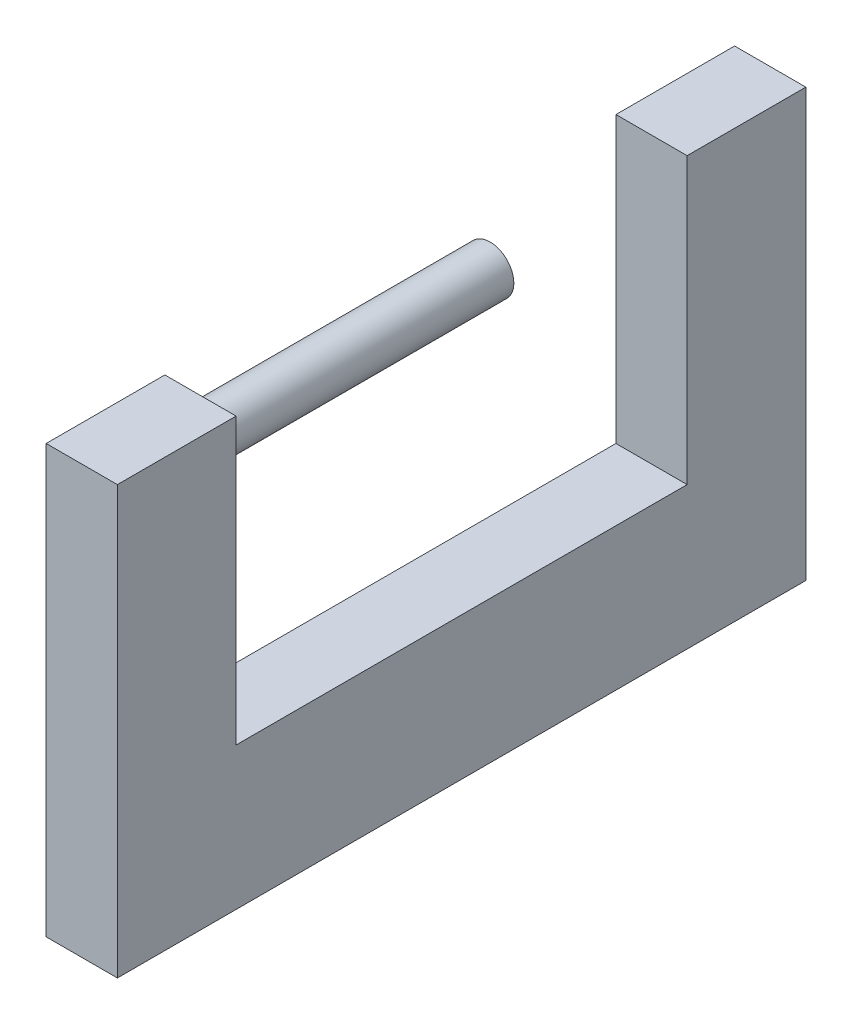
ISO-10303-21;
HEADER;
FILE_DESCRIPTION(('STEP AP214'),'2;1');
FILE_NAME('part.step','',(''),(''),'','','');
FILE_SCHEMA(('AUTOMOTIVE_DESIGN { 1 0 10303 214 1 1 1 1 }'));
ENDSEC;
DATA;
#1=APPLICATION_CONTEXT('core data for automotive mechanical design processes');
#2=APPLICATION_PROTOCOL_DEFINITION('international standard','automotive_design',2000,#1);
#3=PRODUCT_CONTEXT('',#1,'mechanical');
#4=PRODUCT('Part','Part','',(#3));
#5=PRODUCT_RELATED_PRODUCT_CATEGORY('part','',(#4));
#6=PRODUCT_DEFINITION_FORMATION('','',#4);
#7=PRODUCT_DEFINITION_CONTEXT('part definition',#1,'design');
#8=PRODUCT_DEFINITION('design','',#6,#7);
#9=PRODUCT_DEFINITION_SHAPE('','',#8);
#10=(LENGTH_UNIT() NAMED_UNIT(*) SI_UNIT(.MILLI.,.METRE.));
#11=(NAMED_UNIT(*) PLANE_ANGLE_UNIT() SI_UNIT($,.RADIAN.));
#12=(NAMED_UNIT(*) SI_UNIT($,.STERADIAN.) SOLID_ANGLE_UNIT());
#13=UNCERTAINTY_MEASURE_WITH_UNIT(LENGTH_MEASURE(1.E-05),#10,'distance_accuracy_value','');
#14=(GEOMETRIC_REPRESENTATION_CONTEXT(3) GLOBAL_UNCERTAINTY_ASSIGNED_CONTEXT((#13)) GLOBAL_UNIT_ASSIGNED_CONTEXT((#10,
#11,#12)) REPRESENTATION_CONTEXT('',''));
#15=CARTESIAN_POINT('',(0.,0.,0.));
#16=DIRECTION('',(0.,0.,1.));
#17=DIRECTION('',(1.,0.,0.));
#18=AXIS2_PLACEMENT_3D('',#15,#16,#17);
#19=CARTESIAN_POINT('',(15.,60.,0.));
#20=DIRECTION('',(0.,0.,-1.));
#21=DIRECTION('',(-1.,0.,0.));
#22=AXIS2_PLACEMENT_3D('',#19,#20,#21);
#23=PLANE('',#22);
#24=DIRECTION('',(0.,-1.,0.));
#25=VECTOR('',#24,1.);
#26=CARTESIAN_POINT('',(0.,60.,0.));
#27=LINE('',#26,#25);
#28=CARTESIAN_POINT('',(0.,60.,0.));
#29=VERTEX_POINT('',#28);
#30=CARTESIAN_POINT('',(0.,0.,0.));
#31=VERTEX_POINT('',#30);
#32=EDGE_CURVE('E137',#29,#31,#27,.T.);
#33=ORIENTED_EDGE('',*,*,#32,.T.);
#34=DIRECTION('',(-1.,0.,0.));
#35=VECTOR('',#34,1.);
#36=CARTESIAN_POINT('',(15.,0.,0.));
#37=LINE('',#36,#35);
#38=CARTESIAN_POINT('',(15.,0.,0.));
#39=VERTEX_POINT('',#38);
#40=EDGE_CURVE('E50',#39,#31,#37,.T.);
#41=ORIENTED_EDGE('',*,*,#40,.F.);
#42=DIRECTION('',(0.,-1.,0.));
#43=VECTOR('',#42,1.);
#44=CARTESIAN_POINT('',(15.,60.,0.));
#45=LINE('',#44,#43);
#46=CARTESIAN_POINT('',(15.,60.,0.));
#47=VERTEX_POINT('',#46);
#48=EDGE_CURVE('E151',#47,#39,#45,.T.);
#49=ORIENTED_EDGE('',*,*,#48,.F.);
#50=DIRECTION('',(-1.,0.,0.));
#51=VECTOR('',#50,1.);
#52=CARTESIAN_POINT('',(15.,60.,0.));
#53=LINE('',#52,#51);
#54=EDGE_CURVE('E135',#47,#29,#53,.T.);
#55=ORIENTED_EDGE('',*,*,#54,.T.);
#56=EDGE_LOOP('',(#33,#41,#49,#55));
#57=FACE_BOUND('',#56,.T.);
#58=ADVANCED_FACE('F39',(#57),#23,.F.);
#59=CARTESIAN_POINT('',(15.,0.,0.));
#60=DIRECTION('',(0.,-1.,0.));
#61=DIRECTION('',(0.,0.,-1.));
#62=AXIS2_PLACEMENT_3D('',#59,#60,#61);
#63=PLANE('',#62);
#64=DIRECTION('',(0.,0.,1.));
#65=VECTOR('',#64,1.);
#66=CARTESIAN_POINT('',(0.,0.,0.));
#67=LINE('',#66,#65);
#68=CARTESIAN_POINT('',(0.,0.,95.));
#69=VERTEX_POINT('',#68);
#70=EDGE_CURVE('E136',#31,#69,#67,.T.);
#71=ORIENTED_EDGE('',*,*,#70,.T.);
#72=DIRECTION('',(-1.,0.,0.));
#73=VECTOR('',#72,1.);
#74=CARTESIAN_POINT('',(15.,0.,95.));
#75=LINE('',#74,#73);
#76=CARTESIAN_POINT('',(15.,0.,95.));
#77=VERTEX_POINT('',#76);
#78=EDGE_CURVE('E161',#77,#69,#75,.T.);
#79=ORIENTED_EDGE('',*,*,#78,.F.);
#80=DIRECTION('',(0.,0.,1.));
#81=VECTOR('',#80,1.);
#82=CARTESIAN_POINT('',(15.,0.,0.));
#83=LINE('',#82,#81);
#84=EDGE_CURVE('E97',#39,#77,#83,.T.);
#85=ORIENTED_EDGE('',*,*,#84,.F.);
#86=ORIENTED_EDGE('',*,*,#40,.T.);
#87=EDGE_LOOP('',(#71,#79,#85,#86));
#88=FACE_BOUND('',#87,.T.);
#89=ADVANCED_FACE('F163',(#88),#63,.F.);
#90=CARTESIAN_POINT('',(15.,0.,95.));
#91=DIRECTION('',(0.,0.,1.));
#92=DIRECTION('',(0.,-1.,0.));
#93=AXIS2_PLACEMENT_3D('',#90,#91,#92);
#94=PLANE('',#93);
#95=CARTESIAN_POINT('',(7.5,52.5,95.));
#96=DIRECTION('',(0.,0.,1.));
#97=DIRECTION('',(0.,-1.,0.));
#98=AXIS2_PLACEMENT_3D('',#95,#96,#97);
#99=CIRCLE('',#98,5.);
#100=CARTESIAN_POINT('',(7.5,47.5,95.));
#101=VERTEX_POINT('',#100);
#102=EDGE_CURVE('E11',#101,#101,#99,.F.);
#103=ORIENTED_EDGE('',*,*,#102,.F.);
#104=EDGE_LOOP('',(#103));
#105=FACE_BOUND('',#104,.T.);
#106=DIRECTION('',(0.,1.,0.));
#107=VECTOR('',#106,1.);
#108=CARTESIAN_POINT('',(0.,0.,95.));
#109=LINE('',#108,#107);
#110=CARTESIAN_POINT('',(0.,60.,95.));
#111=VERTEX_POINT('',#110);
#112=EDGE_CURVE('E142',#69,#111,#109,.T.);
#113=ORIENTED_EDGE('',*,*,#112,.T.);
#114=DIRECTION('',(-1.,0.,0.));
#115=VECTOR('',#114,1.);
#116=CARTESIAN_POINT('',(15.,60.,95.));
#117=LINE('',#116,#115);
#118=CARTESIAN_POINT('',(15.,60.,95.));
#119=VERTEX_POINT('',#118);
#120=EDGE_CURVE('E158',#119,#111,#117,.T.);
#121=ORIENTED_EDGE('',*,*,#120,.F.);
#122=DIRECTION('',(0.,1.,0.));
#123=VECTOR('',#122,1.);
#124=CARTESIAN_POINT('',(15.,0.,95.));
#125=LINE('',#124,#123);
#126=EDGE_CURVE('E185',#77,#119,#125,.T.);
#127=ORIENTED_EDGE('',*,*,#126,.F.);
#128=ORIENTED_EDGE('',*,*,#78,.T.);
#129=EDGE_LOOP('',(#113,#121,#127,#128));
#130=FACE_BOUND('',#129,.T.);
#131=ADVANCED_FACE('F173',(#105,#130),#94,.F.);
#132=CARTESIAN_POINT('',(15.,60.,95.));
#133=DIRECTION('',(0.,-1.,0.));
#134=DIRECTION('',(0.,0.,-1.));
#135=AXIS2_PLACEMENT_3D('',#132,#133,#134);
#136=PLANE('',#135);
#137=DIRECTION('',(0.,0.,1.));
#138=VECTOR('',#137,1.);
#139=CARTESIAN_POINT('',(0.,60.,95.));
#140=LINE('',#139,#138);
#141=CARTESIAN_POINT('',(0.,60.,120.));
#142=VERTEX_POINT('',#141);
#143=EDGE_CURVE('E145',#111,#142,#140,.T.);
#144=ORIENTED_EDGE('',*,*,#143,.T.);
#145=DIRECTION('',(-1.,0.,0.));
#146=VECTOR('',#145,1.);
#147=CARTESIAN_POINT('',(15.,60.,120.));
#148=LINE('',#147,#146);
#149=CARTESIAN_POINT('',(15.,60.,120.));
#150=VERTEX_POINT('',#149);
#151=EDGE_CURVE('E154',#150,#142,#148,.T.);
#152=ORIENTED_EDGE('',*,*,#151,.F.);
#153=DIRECTION('',(0.,0.,1.));
#154=VECTOR('',#153,1.);
#155=CARTESIAN_POINT('',(15.,60.,95.));
#156=LINE('',#155,#154);
#157=EDGE_CURVE('E182',#119,#150,#156,.T.);
#158=ORIENTED_EDGE('',*,*,#157,.F.);
#159=ORIENTED_EDGE('',*,*,#120,.T.);
#160=EDGE_LOOP('',(#144,#152,#158,#159));
#161=FACE_BOUND('',#160,.T.);
#162=ADVANCED_FACE('F176',(#161),#136,.F.);
#163=CARTESIAN_POINT('',(15.,60.,120.));
#164=DIRECTION('',(0.,0.,-1.));
#165=DIRECTION('',(0.,1.,0.));
#166=AXIS2_PLACEMENT_3D('',#163,#164,#165);
#167=PLANE('',#166);
#168=DIRECTION('',(0.,-1.,0.));
#169=VECTOR('',#168,1.);
#170=CARTESIAN_POINT('',(0.,60.,120.));
#171=LINE('',#170,#169);
#172=CARTESIAN_POINT('',(0.,-30.,120.));
#173=VERTEX_POINT('',#172);
#174=EDGE_CURVE('E148',#142,#173,#171,.T.);
#175=ORIENTED_EDGE('',*,*,#174,.T.);
#176=DIRECTION('',(-1.,0.,0.));
#177=VECTOR('',#176,1.);
#178=CARTESIAN_POINT('',(15.,-30.,120.));
#179=LINE('',#178,#177);
#180=CARTESIAN_POINT('',(15.,-30.,120.));
#181=VERTEX_POINT('',#180);
#182=EDGE_CURVE('E130',#181,#173,#179,.T.);
#183=ORIENTED_EDGE('',*,*,#182,.F.);
#184=DIRECTION('',(0.,-1.,0.));
#185=VECTOR('',#184,1.);
#186=CARTESIAN_POINT('',(15.,60.,120.));
#187=LINE('',#186,#185);
#188=EDGE_CURVE('E119',#150,#181,#187,.T.);
#189=ORIENTED_EDGE('',*,*,#188,.F.);
#190=ORIENTED_EDGE('',*,*,#151,.T.);
#191=EDGE_LOOP('',(#175,#183,#189,#190));
#192=FACE_BOUND('',#191,.T.);
#193=ADVANCED_FACE('F202',(#192),#167,.F.);
#194=CARTESIAN_POINT('',(15.,-30.,120.));
#195=DIRECTION('',(0.,1.,0.));
#196=DIRECTION('',(0.,0.,1.));
#197=AXIS2_PLACEMENT_3D('',#194,#195,#196);
#198=PLANE('',#197);
#199=DIRECTION('',(0.,0.,-1.));
#200=VECTOR('',#199,1.);
#201=CARTESIAN_POINT('',(0.,-30.,120.));
#202=LINE('',#201,#200);
#203=CARTESIAN_POINT('',(0.,-30.,-25.));
#204=VERTEX_POINT('',#203);
#205=EDGE_CURVE('E127',#173,#204,#202,.T.);
#206=ORIENTED_EDGE('',*,*,#205,.T.);
#207=DIRECTION('',(-1.,0.,0.));
#208=VECTOR('',#207,1.);
#209=CARTESIAN_POINT('',(15.,-30.,-25.));
#210=LINE('',#209,#208);
#211=CARTESIAN_POINT('',(15.,-30.,-25.));
#212=VERTEX_POINT('',#211);
#213=EDGE_CURVE('E124',#212,#204,#210,.T.);
#214=ORIENTED_EDGE('',*,*,#213,.F.);
#215=DIRECTION('',(0.,0.,-1.));
#216=VECTOR('',#215,1.);
#217=CARTESIAN_POINT('',(15.,-30.,120.));
#218=LINE('',#217,#216);
#219=EDGE_CURVE('E115',#181,#212,#218,.T.);
#220=ORIENTED_EDGE('',*,*,#219,.F.);
#221=ORIENTED_EDGE('',*,*,#182,.T.);
#222=EDGE_LOOP('',(#206,#214,#220,#221));
#223=FACE_BOUND('',#222,.T.);
#224=ADVANCED_FACE('F121',(#223),#198,.F.);
#225=CARTESIAN_POINT('',(15.,-30.,-25.));
#226=DIRECTION('',(0.,0.,1.));
#227=DIRECTION('',(1.,0.,0.));
#228=AXIS2_PLACEMENT_3D('',#225,#226,#227);
#229=PLANE('',#228);
#230=DIRECTION('',(0.,1.,0.));
#231=VECTOR('',#230,1.);
#232=CARTESIAN_POINT('',(0.,-30.,-25.));
#233=LINE('',#232,#231);
#234=CARTESIAN_POINT('',(0.,60.,-25.));
#235=VERTEX_POINT('',#234);
#236=EDGE_CURVE('E81',#204,#235,#233,.T.);
#237=ORIENTED_EDGE('',*,*,#236,.T.);
#238=DIRECTION('',(-1.,0.,0.));
#239=VECTOR('',#238,1.);
#240=CARTESIAN_POINT('',(15.,60.,-25.));
#241=LINE('',#240,#239);
#242=CARTESIAN_POINT('',(15.,60.,-25.));
#243=VERTEX_POINT('',#242);
#244=EDGE_CURVE('E126',#243,#235,#241,.T.);
#245=ORIENTED_EDGE('',*,*,#244,.F.);
#246=DIRECTION('',(0.,1.,0.));
#247=VECTOR('',#246,1.);
#248=CARTESIAN_POINT('',(15.,-30.,-25.));
#249=LINE('',#248,#247);
#250=EDGE_CURVE('E117',#212,#243,#249,.T.);
#251=ORIENTED_EDGE('',*,*,#250,.F.);
#252=ORIENTED_EDGE('',*,*,#213,.T.);
#253=EDGE_LOOP('',(#237,#245,#251,#252));
#254=FACE_BOUND('',#253,.T.);
#255=ADVANCED_FACE('F128',(#254),#229,.F.);
#256=CARTESIAN_POINT('',(15.,60.,-25.));
#257=DIRECTION('',(0.,-1.,0.));
#258=DIRECTION('',(0.,0.,-1.));
#259=AXIS2_PLACEMENT_3D('',#256,#257,#258);
#260=PLANE('',#259);
#261=DIRECTION('',(0.,0.,1.));
#262=VECTOR('',#261,1.);
#263=CARTESIAN_POINT('',(0.,60.,-25.));
#264=LINE('',#263,#262);
#265=EDGE_CURVE('E89',#235,#29,#264,.T.);
#266=ORIENTED_EDGE('',*,*,#265,.T.);
#267=ORIENTED_EDGE('',*,*,#54,.F.);
#268=DIRECTION('',(0.,0.,1.));
#269=VECTOR('',#268,1.);
#270=CARTESIAN_POINT('',(15.,60.,-25.));
#271=LINE('',#270,#269);
#272=EDGE_CURVE('E54',#243,#47,#271,.T.);
#273=ORIENTED_EDGE('',*,*,#272,.F.);
#274=ORIENTED_EDGE('',*,*,#244,.T.);
#275=EDGE_LOOP('',(#266,#267,#273,#274));
#276=FACE_BOUND('',#275,.T.);
#277=ADVANCED_FACE('F244',(#276),#260,.F.);
#278=CARTESIAN_POINT('',(15.,0.,0.));
#279=DIRECTION('',(-1.,0.,0.));
#280=DIRECTION('',(0.,0.,1.));
#281=AXIS2_PLACEMENT_3D('',#278,#279,#280);
#282=PLANE('',#281);
#283=ORIENTED_EDGE('',*,*,#48,.T.);
#284=ORIENTED_EDGE('',*,*,#84,.T.);
#285=ORIENTED_EDGE('',*,*,#126,.T.);
#286=ORIENTED_EDGE('',*,*,#157,.T.);
#287=ORIENTED_EDGE('',*,*,#188,.T.);
#288=ORIENTED_EDGE('',*,*,#219,.T.);
#289=ORIENTED_EDGE('',*,*,#250,.T.);
#290=ORIENTED_EDGE('',*,*,#272,.T.);
#291=EDGE_LOOP('',(#283,#284,#285,#286,#287,#288,#289,#290));
#292=FACE_BOUND('',#291,.T.);
#293=ADVANCED_FACE('F111',(#292),#282,.F.);
#294=CARTESIAN_POINT('',(0.,0.,0.));
#295=DIRECTION('',(-1.,0.,0.));
#296=DIRECTION('',(0.,0.,1.));
#297=AXIS2_PLACEMENT_3D('',#294,#295,#296);
#298=PLANE('',#297);
#299=ORIENTED_EDGE('',*,*,#32,.F.);
#300=ORIENTED_EDGE('',*,*,#265,.F.);
#301=ORIENTED_EDGE('',*,*,#236,.F.);
#302=ORIENTED_EDGE('',*,*,#205,.F.);
#303=ORIENTED_EDGE('',*,*,#174,.F.);
#304=ORIENTED_EDGE('',*,*,#143,.F.);
#305=ORIENTED_EDGE('',*,*,#112,.F.);
#306=ORIENTED_EDGE('',*,*,#70,.F.);
#307=EDGE_LOOP('',(#299,#300,#301,#302,#303,#304,#305,#306));
#308=FACE_BOUND('',#307,.T.);
#309=ADVANCED_FACE('F166',(#308),#298,.T.);
#310=CARTESIAN_POINT('',(7.5,52.5,34.));
#311=DIRECTION('',(0.,0.,1.));
#312=DIRECTION('',(0.,-1.,0.));
#313=AXIS2_PLACEMENT_3D('',#310,#311,#312);
#314=CYLINDRICAL_SURFACE('',#313,5.);
#315=CARTESIAN_POINT('',(7.5,52.5,34.));
#316=DIRECTION('',(0.,0.,-1.));
#317=DIRECTION('',(0.,1.,0.));
#318=AXIS2_PLACEMENT_3D('',#315,#316,#317);
#319=CIRCLE('',#318,5.);
#320=CARTESIAN_POINT('',(7.5,47.5,34.));
#321=VERTEX_POINT('',#320);
#322=EDGE_CURVE('E138',#321,#321,#319,.T.);
#323=CARTESIAN_POINT('',(7.5,47.5,34.));
#324=CARTESIAN_POINT('',(7.5,47.5,34.6354166666667));
#325=CARTESIAN_POINT('',(7.5,47.5,35.2708333333333));
#326=CARTESIAN_POINT('',(7.5,47.5,36.5416666666666));
#327=CARTESIAN_POINT('',(7.5,47.5,37.1770833333333));
#328=CARTESIAN_POINT('',(7.5,47.5,38.4479166666666));
#329=CARTESIAN_POINT('',(7.5,47.5,39.0833333333333));
#330=CARTESIAN_POINT('',(7.5,47.5,40.3541666666666));
#331=CARTESIAN_POINT('',(7.5,47.5,40.9895833333333));
#332=CARTESIAN_POINT('',(7.5,47.5,42.2604166666667));
#333=CARTESIAN_POINT('',(7.5,47.5,42.8958333333333));
#334=CARTESIAN_POINT('',(7.5,47.5,44.1666666666666));
#335=CARTESIAN_POINT('',(7.5,47.5,44.8020833333333));
#336=CARTESIAN_POINT('',(7.5,47.5,46.0729166666666));
#337=CARTESIAN_POINT('',(7.5,47.5,46.7083333333333));
#338=CARTESIAN_POINT('',(7.5,47.5,47.9791666666666));
#339=CARTESIAN_POINT('',(7.5,47.5,48.6145833333333));
#340=CARTESIAN_POINT('',(7.5,47.5,49.8854166666666));
#341=CARTESIAN_POINT('',(7.5,47.5,50.5208333333333));
#342=CARTESIAN_POINT('',(7.5,47.5,51.7916666666666));
#343=CARTESIAN_POINT('',(7.5,47.5,52.4270833333333));
#344=CARTESIAN_POINT('',(7.5,47.5,53.6979166666666));
#345=CARTESIAN_POINT('',(7.5,47.5,54.3333333333333));
#346=CARTESIAN_POINT('',(7.5,47.5,55.6041666666666));
#347=CARTESIAN_POINT('',(7.5,47.5,56.2395833333333));
#348=CARTESIAN_POINT('',(7.5,47.5,57.5104166666667));
#349=CARTESIAN_POINT('',(7.5,47.5,58.1458333333333));
#350=CARTESIAN_POINT('',(7.5,47.5,59.4166666666666));
#351=CARTESIAN_POINT('',(7.5,47.5,60.0520833333333));
#352=CARTESIAN_POINT('',(7.5,47.5,61.3229166666666));
#353=CARTESIAN_POINT('',(7.5,47.5,61.9583333333333));
#354=CARTESIAN_POINT('',(7.5,47.5,63.2291666666666));
#355=CARTESIAN_POINT('',(7.5,47.5,63.8645833333333));
#356=CARTESIAN_POINT('',(7.5,47.5,65.1354166666666));
#357=CARTESIAN_POINT('',(7.5,47.5,65.7708333333333));
#358=CARTESIAN_POINT('',(7.5,47.5,67.0416666666666));
#359=CARTESIAN_POINT('',(7.5,47.5,67.6770833333333));
#360=CARTESIAN_POINT('',(7.5,47.5,68.9479166666666));
#361=CARTESIAN_POINT('',(7.5,47.5,69.5833333333333));
#362=CARTESIAN_POINT('',(7.5,47.5,70.8541666666666));
#363=CARTESIAN_POINT('',(7.5,47.5,71.4895833333333));
#364=CARTESIAN_POINT('',(7.5,47.5,72.7604166666666));
#365=CARTESIAN_POINT('',(7.5,47.5,73.3958333333333));
#366=CARTESIAN_POINT('',(7.5,47.5,74.6666666666666));
#367=CARTESIAN_POINT('',(7.5,47.5,75.3020833333333));
#368=CARTESIAN_POINT('',(7.5,47.5,76.5729166666666));
#369=CARTESIAN_POINT('',(7.5,47.5,77.2083333333333));
#370=CARTESIAN_POINT('',(7.5,47.5,78.4791666666666));
#371=CARTESIAN_POINT('',(7.5,47.5,79.1145833333333));
#372=CARTESIAN_POINT('',(7.5,47.5,80.3854166666667));
#373=CARTESIAN_POINT('',(7.5,47.5,81.0208333333333));
#374=CARTESIAN_POINT('',(7.5,47.5,82.2916666666667));
#375=CARTESIAN_POINT('',(7.5,47.5,82.9270833333333));
#376=CARTESIAN_POINT('',(7.5,47.5,84.1979166666667));
#377=CARTESIAN_POINT('',(7.5,47.5,84.8333333333333));
#378=CARTESIAN_POINT('',(7.5,47.5,86.1041666666666));
#379=CARTESIAN_POINT('',(7.5,47.5,86.7395833333333));
#380=CARTESIAN_POINT('',(7.5,47.5,88.0104166666666));
#381=CARTESIAN_POINT('',(7.5,47.5,88.6458333333333));
#382=CARTESIAN_POINT('',(7.5,47.5,89.9166666666666));
#383=CARTESIAN_POINT('',(7.5,47.5,90.5520833333333));
#384=CARTESIAN_POINT('',(7.5,47.5,91.8229166666666));
#385=CARTESIAN_POINT('',(7.5,47.5,92.4583333333333));
#386=CARTESIAN_POINT('',(7.5,47.5,93.7291666666666));
#387=CARTESIAN_POINT('',(7.5,47.5,94.3645833333333));
#388=CARTESIAN_POINT('',(7.5,47.5,95.));
#389=B_SPLINE_CURVE_WITH_KNOTS('',3,(#323,#324,#325,#326,#327,#328,#329,#330,#331,#332,#333,
#334,#335,#336,#337,#338,#339,#340,#341,#342,#343,#344,#345,#346,#347,#348,#349,#350,#351,#352,
#353,#354,#355,#356,#357,#358,#359,#360,#361,#362,#363,#364,#365,#366,#367,#368,#369,#370,#371,
#372,#373,#374,#375,#376,#377,#378,#379,#380,#381,#382,#383,#384,#385,#386,#387,#388),
.UNSPECIFIED.,.F.,.F.,(4,2,2,2,2,2,2,2,2,2,2,2,2,2,2,2,2,2,2,2,2,2,2,2,2,2,2,2,2,2,2,2,4),(0.,
1.90625,3.8125,5.71874999999999,7.625,9.53125,11.4375,13.34375,15.25,17.15625,19.0625,20.96875,
22.875,24.78125,26.6875,28.59375,30.5,32.40625,34.3125,36.21875,38.125,40.03125,41.9375,
43.84375,45.75,47.65625,49.5625,51.46875,53.375,55.28125,57.1875,59.09375,61.),.UNSPECIFIED.);
#390=EDGE_CURVE('BSEAM194',#321,#101,#389,.T.);
#391=ORIENTED_EDGE('',*,*,#322,.F.);
#392=ORIENTED_EDGE('',*,*,#102,.T.);
#393=ORIENTED_EDGE('',*,*,#390,.T.);
#394=ORIENTED_EDGE('',*,*,#390,.F.);
#395=EDGE_LOOP('',(#391,#393,#392,#394));
#396=FACE_BOUND('',#395,.T.);
#397=ADVANCED_FACE('F194',(#396),#314,.T.);
#398=CARTESIAN_POINT('',(7.5,52.5,34.));
#399=DIRECTION('',(0.,0.,-1.));
#400=DIRECTION('',(0.,1.,0.));
#401=AXIS2_PLACEMENT_3D('',#398,#399,#400);
#402=PLANE('',#401);
#403=ORIENTED_EDGE('',*,*,#322,.T.);
#404=EDGE_LOOP('',(#403));
#405=FACE_BOUND('',#404,.T.);
#406=ADVANCED_FACE('F192',(#405),#402,.T.);
#407=CLOSED_SHELL('',(#58,#89,#131,#162,#193,#224,#255,#277,#293,#309,#397,#406));
#408=MANIFOLD_SOLID_BREP('B2',#407);
#409=ADVANCED_BREP_SHAPE_REPRESENTATION('',(#18,#408),#14);
#410=SHAPE_DEFINITION_REPRESENTATION(#9,#409);
ENDSEC;
END-ISO-10303-21;
